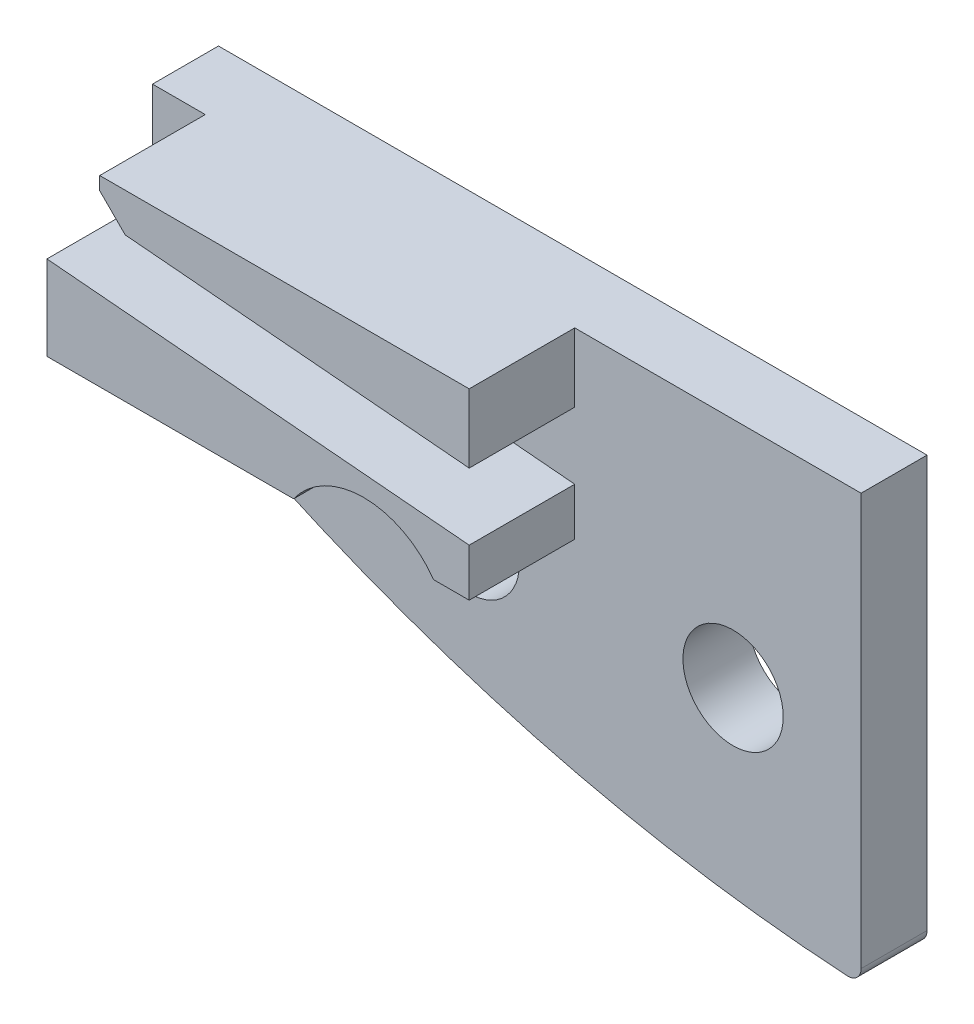
ISO-10303-21;
HEADER;
FILE_DESCRIPTION(('STEP AP214'),'2;1');
FILE_NAME('part.step','',(''),(''),'','','');
FILE_SCHEMA(('AUTOMOTIVE_DESIGN { 1 0 10303 214 1 1 1 1 }'));
ENDSEC;
DATA;
#1=APPLICATION_CONTEXT('core data for automotive mechanical design processes');
#2=APPLICATION_PROTOCOL_DEFINITION('international standard','automotive_design',2000,#1);
#3=PRODUCT_CONTEXT('',#1,'mechanical');
#4=PRODUCT('Part','Part','',(#3));
#5=PRODUCT_RELATED_PRODUCT_CATEGORY('part','',(#4));
#6=PRODUCT_DEFINITION_FORMATION('','',#4);
#7=PRODUCT_DEFINITION_CONTEXT('part definition',#1,'design');
#8=PRODUCT_DEFINITION('design','',#6,#7);
#9=PRODUCT_DEFINITION_SHAPE('','',#8);
#10=(LENGTH_UNIT() NAMED_UNIT(*) SI_UNIT(.MILLI.,.METRE.));
#11=(NAMED_UNIT(*) PLANE_ANGLE_UNIT() SI_UNIT($,.RADIAN.));
#12=(NAMED_UNIT(*) SI_UNIT($,.STERADIAN.) SOLID_ANGLE_UNIT());
#13=UNCERTAINTY_MEASURE_WITH_UNIT(LENGTH_MEASURE(1.E-05),#10,'distance_accuracy_value','');
#14=(GEOMETRIC_REPRESENTATION_CONTEXT(3) GLOBAL_UNCERTAINTY_ASSIGNED_CONTEXT((#13)) GLOBAL_UNIT_ASSIGNED_CONTEXT((#10,
#11,#12)) REPRESENTATION_CONTEXT('',''));
#15=CARTESIAN_POINT('',(0.,0.,0.));
#16=DIRECTION('',(0.,0.,1.));
#17=DIRECTION('',(1.,0.,0.));
#18=AXIS2_PLACEMENT_3D('',#15,#16,#17);
#19=CARTESIAN_POINT('',(-38.1,11.7820282764121,8.255));
#20=DIRECTION('',(0.,1.,0.));
#21=DIRECTION('',(0.,0.,1.));
#22=AXIS2_PLACEMENT_3D('',#19,#20,#21);
#23=PLANE('',#22);
#24=DIRECTION('',(1.,0.,0.));
#25=VECTOR('',#24,1.);
#26=CARTESIAN_POINT('',(-38.1,11.7820282764121,3.175));
#27=LINE('',#26,#25);
#28=CARTESIAN_POINT('',(-38.1,11.7820282764121,3.175));
#29=VERTEX_POINT('',#28);
#30=CARTESIAN_POINT('',(-26.2293716665378,11.7820282764121,3.175));
#31=VERTEX_POINT('',#30);
#32=EDGE_CURVE('E186',#29,#31,#27,.T.);
#33=ORIENTED_EDGE('',*,*,#32,.T.);
#34=DIRECTION('',(0.,0.,1.));
#35=VECTOR('',#34,1.);
#36=CARTESIAN_POINT('',(-26.2293716665378,11.7820282764121,3.175));
#37=LINE('',#36,#35);
#38=CARTESIAN_POINT('',(-26.2293716665378,11.7820282764121,8.255));
#39=VERTEX_POINT('',#38);
#40=EDGE_CURVE('E152',#31,#39,#37,.T.);
#41=ORIENTED_EDGE('',*,*,#40,.T.);
#42=DIRECTION('',(1.,0.,0.));
#43=VECTOR('',#42,1.);
#44=CARTESIAN_POINT('',(-38.1,11.7820282764121,8.255));
#45=LINE('',#44,#43);
#46=CARTESIAN_POINT('',(-38.1,11.7820282764121,8.255));
#47=VERTEX_POINT('',#46);
#48=EDGE_CURVE('E303',#47,#39,#45,.T.);
#49=ORIENTED_EDGE('',*,*,#48,.F.);
#50=DIRECTION('',(0.,0.,-1.));
#51=VECTOR('',#50,1.);
#52=CARTESIAN_POINT('',(-38.1,11.7820282764121,8.255));
#53=LINE('',#52,#51);
#54=EDGE_CURVE('E193',#47,#29,#53,.T.);
#55=ORIENTED_EDGE('',*,*,#54,.T.);
#56=EDGE_LOOP('',(#33,#41,#49,#55));
#57=FACE_BOUND('',#56,.T.);
#58=ADVANCED_FACE('F32',(#57),#23,.F.);
#59=CARTESIAN_POINT('',(0.,76.2,3.175));
#60=DIRECTION('',(0.,0.,-1.));
#61=DIRECTION('',(-1.,0.,0.));
#62=AXIS2_PLACEMENT_3D('',#59,#60,#61);
#63=PLANE('',#62);
#64=CARTESIAN_POINT('',(-10.16,9.398,3.175));
#65=DIRECTION('',(0.,0.,1.));
#66=DIRECTION('',(1.,0.,0.));
#67=AXIS2_PLACEMENT_3D('',#64,#65,#66);
#68=CIRCLE('',#67,2.413);
#69=CARTESIAN_POINT('',(-7.747,9.398,3.175));
#70=VERTEX_POINT('',#69);
#71=EDGE_CURVE('E218',#70,#70,#68,.T.);
#72=ORIENTED_EDGE('',*,*,#71,.F.);
#73=EDGE_LOOP('',(#72));
#74=FACE_BOUND('',#73,.T.);
#75=CARTESIAN_POINT('',(-19.4906283334622,11.7820282764121,3.175));
#76=VERTEX_POINT('',#75);
#77=CARTESIAN_POINT('',(-17.78,11.7820282764121,3.175));
#78=VERTEX_POINT('',#77);
#79=EDGE_CURVE('E161',#76,#78,#27,.T.);
#80=ORIENTED_EDGE('',*,*,#79,.F.);
#81=CARTESIAN_POINT('',(-22.86,9.398,3.175));
#82=DIRECTION('',(0.,0.,1.));
#83=DIRECTION('',(1.,0.,0.));
#84=AXIS2_PLACEMENT_3D('',#81,#82,#83);
#85=CIRCLE('',#84,4.1275);
#86=EDGE_CURVE('E149',#76,#31,#85,.T.);
#87=ORIENTED_EDGE('',*,*,#86,.T.);
#88=ORIENTED_EDGE('',*,*,#32,.F.);
#89=DIRECTION('',(0.,-1.,0.));
#90=VECTOR('',#89,1.);
#91=CARTESIAN_POINT('',(-38.1,20.591373254799,3.175));
#92=LINE('',#91,#90);
#93=CARTESIAN_POINT('',(-38.1,10.5765057315598,3.175));
#94=VERTEX_POINT('',#93);
#95=EDGE_CURVE('E190',#29,#94,#92,.T.);
#96=ORIENTED_EDGE('',*,*,#95,.T.);
#97=CARTESIAN_POINT('',(-37.465,10.5765057315598,3.175));
#98=DIRECTION('',(0.,0.,-1.));
#99=DIRECTION('',(-1.,0.,0.));
#100=AXIS2_PLACEMENT_3D('',#97,#98,#99);
#101=CIRCLE('',#100,0.635);
#102=CARTESIAN_POINT('',(-37.7798319327731,10.0250477965309,3.175));
#103=VERTEX_POINT('',#102);
#104=EDGE_CURVE('E40',#94,#103,#101,.F.);
#105=ORIENTED_EDGE('',*,*,#104,.T.);
#106=CARTESIAN_POINT('',(0.,76.2,3.175));
#107=DIRECTION('',(0.,0.,1.));
#108=DIRECTION('',(-1.,0.,0.));
#109=AXIS2_PLACEMENT_3D('',#106,#107,#108);
#110=CIRCLE('',#109,76.2);
#111=CARTESIAN_POINT('',(-4.67394957983193,0.143480257605869,3.175));
#112=VERTEX_POINT('',#111);
#113=EDGE_CURVE('E224',#103,#112,#110,.T.);
#114=ORIENTED_EDGE('',*,*,#113,.T.);
#115=CARTESIAN_POINT('',(-4.635,0.77728458879249,3.175));
#116=DIRECTION('',(0.,0.,-1.));
#117=DIRECTION('',(-1.,0.,0.));
#118=AXIS2_PLACEMENT_3D('',#115,#116,#117);
#119=CIRCLE('',#118,0.635);
#120=CARTESIAN_POINT('',(-4.,0.77728458879249,3.175));
#121=VERTEX_POINT('',#120);
#122=EDGE_CURVE('E55',#112,#121,#119,.F.);
#123=ORIENTED_EDGE('',*,*,#122,.T.);
#124=DIRECTION('',(0.,-1.,0.));
#125=VECTOR('',#124,1.);
#126=CARTESIAN_POINT('',(-4.,24.7848492803447,3.175));
#127=LINE('',#126,#125);
#128=CARTESIAN_POINT('',(-4.,20.591373254799,3.175));
#129=VERTEX_POINT('',#128);
#130=EDGE_CURVE('E385',#129,#121,#127,.T.);
#131=ORIENTED_EDGE('',*,*,#130,.F.);
#132=DIRECTION('',(-1.,0.,0.));
#133=VECTOR('',#132,1.);
#134=CARTESIAN_POINT('',(0.,20.591373254799,3.175));
#135=LINE('',#134,#133);
#136=CARTESIAN_POINT('',(-17.78,20.591373254799,3.175));
#137=VERTEX_POINT('',#136);
#138=EDGE_CURVE('E228',#129,#137,#135,.T.);
#139=ORIENTED_EDGE('',*,*,#138,.T.);
#140=DIRECTION('',(0.,1.,0.));
#141=VECTOR('',#140,1.);
#142=CARTESIAN_POINT('',(-17.78,20.591373254799,3.175));
#143=LINE('',#142,#141);
#144=CARTESIAN_POINT('',(-17.78,17.2866637367694,3.175));
#145=VERTEX_POINT('',#144);
#146=EDGE_CURVE('E289',#145,#137,#143,.T.);
#147=ORIENTED_EDGE('',*,*,#146,.F.);
#148=DIRECTION('',(0.996227084748133,-0.0867847660262814,0.));
#149=VECTOR('',#148,1.);
#150=CARTESIAN_POINT('',(-17.78,17.2866637367694,3.175));
#151=LINE('',#150,#149);
#152=CARTESIAN_POINT('',(-34.3322104334303,18.7285836882293,3.175));
#153=VERTEX_POINT('',#152);
#154=EDGE_CURVE('E393',#153,#145,#151,.T.);
#155=ORIENTED_EDGE('',*,*,#154,.F.);
#156=DIRECTION('',(0.70710678118655,-0.707106781186546,0.));
#157=VECTOR('',#156,1.);
#158=CARTESIAN_POINT('',(-34.3322104334303,18.7285836882293,3.175));
#159=LINE('',#158,#157);
#160=CARTESIAN_POINT('',(-35.56,19.956373254799,3.175));
#161=VERTEX_POINT('',#160);
#162=EDGE_CURVE('E285',#161,#153,#159,.T.);
#163=ORIENTED_EDGE('',*,*,#162,.F.);
#164=DIRECTION('',(0.,-1.,0.));
#165=VECTOR('',#164,1.);
#166=CARTESIAN_POINT('',(-35.56,19.956373254799,3.175));
#167=LINE('',#166,#165);
#168=CARTESIAN_POINT('',(-35.56,20.591373254799,3.175));
#169=VERTEX_POINT('',#168);
#170=EDGE_CURVE('E283',#169,#161,#167,.T.);
#171=ORIENTED_EDGE('',*,*,#170,.F.);
#172=CARTESIAN_POINT('',(-38.1,20.591373254799,3.175));
#173=VERTEX_POINT('',#172);
#174=EDGE_CURVE('E226',#169,#173,#135,.T.);
#175=ORIENTED_EDGE('',*,*,#174,.T.);
#176=CARTESIAN_POINT('',(-38.1,15.8460282764121,3.175));
#177=VERTEX_POINT('',#176);
#178=EDGE_CURVE('E177',#173,#177,#92,.T.);
#179=ORIENTED_EDGE('',*,*,#178,.T.);
#180=DIRECTION('',(-0.996227084748133,0.0867847660262814,0.));
#181=VECTOR('',#180,1.);
#182=CARTESIAN_POINT('',(-38.1,15.8460282764121,3.175));
#183=LINE('',#182,#181);
#184=CARTESIAN_POINT('',(-17.78,14.0758832234899,3.175));
#185=VERTEX_POINT('',#184);
#186=EDGE_CURVE('E200',#185,#177,#183,.T.);
#187=ORIENTED_EDGE('',*,*,#186,.F.);
#188=DIRECTION('',(0.,1.,0.));
#189=VECTOR('',#188,1.);
#190=CARTESIAN_POINT('',(-17.78,11.7820282764121,3.175));
#191=LINE('',#190,#189);
#192=EDGE_CURVE('E168',#78,#185,#191,.T.);
#193=ORIENTED_EDGE('',*,*,#192,.F.);
#194=EDGE_LOOP('',(#80,#87,#88,#96,#105,#114,#123,#131,#139,#147,#155,#163,#171,#175,#179,#187,#193));
#195=FACE_BOUND('',#194,.T.);
#196=CARTESIAN_POINT('',(-22.86,9.398,3.175));
#197=DIRECTION('',(0.,0.,1.));
#198=DIRECTION('',(1.,0.,0.));
#199=AXIS2_PLACEMENT_3D('',#196,#197,#198);
#200=CIRCLE('',#199,2.413);
#201=CARTESIAN_POINT('',(-20.447,9.398,3.175));
#202=VERTEX_POINT('',#201);
#203=EDGE_CURVE('E212',#202,#202,#200,.T.);
#204=ORIENTED_EDGE('',*,*,#203,.F.);
#205=EDGE_LOOP('',(#204));
#206=FACE_BOUND('',#205,.T.);
#207=ADVANCED_FACE('F165',(#74,#195,#206),#63,.F.);
#208=CARTESIAN_POINT('',(0.,76.2,0.));
#209=DIRECTION('',(0.,0.,-1.));
#210=DIRECTION('',(-1.,0.,0.));
#211=AXIS2_PLACEMENT_3D('',#208,#209,#210);
#212=PLANE('',#211);
#213=CARTESIAN_POINT('',(0.,76.2,0.));
#214=DIRECTION('',(0.,0.,1.));
#215=DIRECTION('',(-1.,0.,0.));
#216=AXIS2_PLACEMENT_3D('',#213,#214,#215);
#217=CIRCLE('',#216,76.2);
#218=CARTESIAN_POINT('',(-37.7798319327731,10.0250477965309,0.));
#219=VERTEX_POINT('',#218);
#220=CARTESIAN_POINT('',(-4.67394957983193,0.143480257605869,0.));
#221=VERTEX_POINT('',#220);
#222=EDGE_CURVE('E221',#219,#221,#217,.T.);
#223=ORIENTED_EDGE('',*,*,#222,.F.);
#224=CARTESIAN_POINT('',(-37.465,10.5765057315598,0.));
#225=DIRECTION('',(0.,0.,-1.));
#226=DIRECTION('',(-1.,0.,0.));
#227=AXIS2_PLACEMENT_3D('',#224,#225,#226);
#228=CIRCLE('',#227,0.635);
#229=CARTESIAN_POINT('',(-38.1,10.5765057315598,0.));
#230=VERTEX_POINT('',#229);
#231=EDGE_CURVE('E258',#219,#230,#228,.T.);
#232=ORIENTED_EDGE('',*,*,#231,.T.);
#233=DIRECTION('',(0.,-1.,0.));
#234=VECTOR('',#233,1.);
#235=CARTESIAN_POINT('',(-38.1,20.591373254799,0.));
#236=LINE('',#235,#234);
#237=CARTESIAN_POINT('',(-38.1,20.591373254799,0.));
#238=VERTEX_POINT('',#237);
#239=EDGE_CURVE('E227',#238,#230,#236,.T.);
#240=ORIENTED_EDGE('',*,*,#239,.F.);
#241=DIRECTION('',(-1.,0.,0.));
#242=VECTOR('',#241,1.);
#243=CARTESIAN_POINT('',(0.,20.591373254799,0.));
#244=LINE('',#243,#242);
#245=CARTESIAN_POINT('',(-4.,20.591373254799,0.));
#246=VERTEX_POINT('',#245);
#247=EDGE_CURVE('E235',#246,#238,#244,.T.);
#248=ORIENTED_EDGE('',*,*,#247,.F.);
#249=DIRECTION('',(0.,1.,0.));
#250=VECTOR('',#249,1.);
#251=CARTESIAN_POINT('',(-4.00000000000001,76.2,0.));
#252=LINE('',#251,#250);
#253=CARTESIAN_POINT('',(-4.,0.77728458879249,0.));
#254=VERTEX_POINT('',#253);
#255=EDGE_CURVE('E387',#254,#246,#252,.T.);
#256=ORIENTED_EDGE('',*,*,#255,.F.);
#257=CARTESIAN_POINT('',(-4.635,0.77728458879249,0.));
#258=DIRECTION('',(0.,0.,-1.));
#259=DIRECTION('',(-1.,0.,0.));
#260=AXIS2_PLACEMENT_3D('',#257,#258,#259);
#261=CIRCLE('',#260,0.635);
#262=EDGE_CURVE('E253',#254,#221,#261,.T.);
#263=ORIENTED_EDGE('',*,*,#262,.T.);
#264=EDGE_LOOP('',(#223,#232,#240,#248,#256,#263));
#265=FACE_BOUND('',#264,.T.);
#266=CARTESIAN_POINT('',(-10.16,9.398,0.));
#267=DIRECTION('',(0.,0.,1.));
#268=DIRECTION('',(1.,0.,0.));
#269=AXIS2_PLACEMENT_3D('',#266,#267,#268);
#270=CIRCLE('',#269,2.413);
#271=CARTESIAN_POINT('',(-7.747,9.398,0.));
#272=VERTEX_POINT('',#271);
#273=EDGE_CURVE('E215',#272,#272,#270,.T.);
#274=ORIENTED_EDGE('',*,*,#273,.T.);
#275=EDGE_LOOP('',(#274));
#276=FACE_BOUND('',#275,.T.);
#277=CARTESIAN_POINT('',(-22.86,9.398,0.));
#278=DIRECTION('',(0.,0.,1.));
#279=DIRECTION('',(1.,0.,0.));
#280=AXIS2_PLACEMENT_3D('',#277,#278,#279);
#281=CIRCLE('',#280,2.413);
#282=CARTESIAN_POINT('',(-20.447,9.398,0.));
#283=VERTEX_POINT('',#282);
#284=EDGE_CURVE('E196',#283,#283,#281,.T.);
#285=ORIENTED_EDGE('',*,*,#284,.T.);
#286=EDGE_LOOP('',(#285));
#287=FACE_BOUND('',#286,.T.);
#288=ADVANCED_FACE('F269',(#265,#276,#287),#212,.T.);
#289=CARTESIAN_POINT('',(0.,76.2,3.175));
#290=DIRECTION('',(0.,0.,-1.));
#291=DIRECTION('',(-1.,0.,0.));
#292=AXIS2_PLACEMENT_3D('',#289,#290,#291);
#293=CYLINDRICAL_SURFACE('',#292,76.2);
#294=ORIENTED_EDGE('',*,*,#113,.F.);
#295=DIRECTION('',(0.,0.,-1.));
#296=VECTOR('',#295,1.);
#297=CARTESIAN_POINT('',(-37.7798319327731,10.0250477965309,3.175));
#298=LINE('',#297,#296);
#299=EDGE_CURVE('E248',#103,#219,#298,.T.);
#300=ORIENTED_EDGE('',*,*,#299,.T.);
#301=ORIENTED_EDGE('',*,*,#222,.T.);
#302=DIRECTION('',(0.,0.,-1.));
#303=VECTOR('',#302,1.);
#304=CARTESIAN_POINT('',(-4.67394957983193,0.143480257605882,3.175));
#305=LINE('',#304,#303);
#306=EDGE_CURVE('E174',#221,#112,#305,.F.);
#307=ORIENTED_EDGE('',*,*,#306,.T.);
#308=EDGE_LOOP('',(#294,#300,#301,#307));
#309=FACE_BOUND('',#308,.T.);
#310=ADVANCED_FACE('F246',(#309),#293,.T.);
#311=CARTESIAN_POINT('',(0.,20.591373254799,3.175));
#312=DIRECTION('',(0.,-1.,0.));
#313=DIRECTION('',(1.,0.,0.));
#314=AXIS2_PLACEMENT_3D('',#311,#312,#313);
#315=PLANE('',#314);
#316=ORIENTED_EDGE('',*,*,#138,.F.);
#317=DIRECTION('',(0.,0.,-1.));
#318=VECTOR('',#317,1.);
#319=CARTESIAN_POINT('',(-4.,20.591373254799,3.175));
#320=LINE('',#319,#318);
#321=EDGE_CURVE('E170',#129,#246,#320,.T.);
#322=ORIENTED_EDGE('',*,*,#321,.T.);
#323=ORIENTED_EDGE('',*,*,#247,.T.);
#324=DIRECTION('',(0.,0.,-1.));
#325=VECTOR('',#324,1.);
#326=CARTESIAN_POINT('',(-38.1,20.591373254799,3.175));
#327=LINE('',#326,#325);
#328=EDGE_CURVE('E171',#173,#238,#327,.T.);
#329=ORIENTED_EDGE('',*,*,#328,.F.);
#330=ORIENTED_EDGE('',*,*,#174,.F.);
#331=DIRECTION('',(0.,0.,-1.));
#332=VECTOR('',#331,1.);
#333=CARTESIAN_POINT('',(-35.56,20.591373254799,8.255));
#334=LINE('',#333,#332);
#335=CARTESIAN_POINT('',(-35.56,20.591373254799,8.255));
#336=VERTEX_POINT('',#335);
#337=EDGE_CURVE('E280',#336,#169,#334,.T.);
#338=ORIENTED_EDGE('',*,*,#337,.F.);
#339=DIRECTION('',(-1.,0.,0.));
#340=VECTOR('',#339,1.);
#341=CARTESIAN_POINT('',(-35.56,20.591373254799,8.255));
#342=LINE('',#341,#340);
#343=CARTESIAN_POINT('',(-17.78,20.591373254799,8.255));
#344=VERTEX_POINT('',#343);
#345=EDGE_CURVE('E392',#344,#336,#342,.T.);
#346=ORIENTED_EDGE('',*,*,#345,.F.);
#347=DIRECTION('',(0.,0.,-1.));
#348=VECTOR('',#347,1.);
#349=CARTESIAN_POINT('',(-17.78,20.591373254799,8.255));
#350=LINE('',#349,#348);
#351=EDGE_CURVE('E189',#344,#137,#350,.T.);
#352=ORIENTED_EDGE('',*,*,#351,.T.);
#353=EDGE_LOOP('',(#316,#322,#323,#329,#330,#338,#346,#352));
#354=FACE_BOUND('',#353,.T.);
#355=ADVANCED_FACE('F276',(#354),#315,.F.);
#356=CARTESIAN_POINT('',(-38.1,20.591373254799,3.175));
#357=DIRECTION('',(1.,0.,0.));
#358=DIRECTION('',(0.,0.,-1.));
#359=AXIS2_PLACEMENT_3D('',#356,#357,#358);
#360=PLANE('',#359);
#361=ORIENTED_EDGE('',*,*,#239,.T.);
#362=DIRECTION('',(0.,0.,-1.));
#363=VECTOR('',#362,1.);
#364=CARTESIAN_POINT('',(-38.1,10.5765057315598,3.175));
#365=LINE('',#364,#363);
#366=EDGE_CURVE('E260',#230,#94,#365,.F.);
#367=ORIENTED_EDGE('',*,*,#366,.T.);
#368=ORIENTED_EDGE('',*,*,#95,.F.);
#369=ORIENTED_EDGE('',*,*,#54,.F.);
#370=DIRECTION('',(0.,-1.,0.));
#371=VECTOR('',#370,1.);
#372=CARTESIAN_POINT('',(-38.1,15.8460282764121,8.255));
#373=LINE('',#372,#371);
#374=CARTESIAN_POINT('',(-38.1,15.8460282764121,8.255));
#375=VERTEX_POINT('',#374);
#376=EDGE_CURVE('E203',#375,#47,#373,.T.);
#377=ORIENTED_EDGE('',*,*,#376,.F.);
#378=DIRECTION('',(0.,0.,-1.));
#379=VECTOR('',#378,1.);
#380=CARTESIAN_POINT('',(-38.1,15.8460282764121,8.255));
#381=LINE('',#380,#379);
#382=EDGE_CURVE('E204',#375,#177,#381,.T.);
#383=ORIENTED_EDGE('',*,*,#382,.T.);
#384=ORIENTED_EDGE('',*,*,#178,.F.);
#385=ORIENTED_EDGE('',*,*,#328,.T.);
#386=EDGE_LOOP('',(#361,#367,#368,#369,#377,#383,#384,#385));
#387=FACE_BOUND('',#386,.T.);
#388=ADVANCED_FACE('F272',(#387),#360,.F.);
#389=CARTESIAN_POINT('',(-10.16,9.398,3.175));
#390=DIRECTION('',(0.,0.,-1.));
#391=DIRECTION('',(-1.,0.,0.));
#392=AXIS2_PLACEMENT_3D('',#389,#390,#391);
#393=CYLINDRICAL_SURFACE('',#392,2.413);
#394=ORIENTED_EDGE('',*,*,#71,.T.);
#395=EDGE_LOOP('',(#394));
#396=FACE_BOUND('',#395,.T.);
#397=ORIENTED_EDGE('',*,*,#273,.F.);
#398=EDGE_LOOP('',(#397));
#399=FACE_BOUND('',#398,.T.);
#400=ADVANCED_FACE('F337',(#396,#399),#393,.F.);
#401=CARTESIAN_POINT('',(-22.86,9.398,3.175));
#402=DIRECTION('',(0.,0.,-1.));
#403=DIRECTION('',(-1.,0.,0.));
#404=AXIS2_PLACEMENT_3D('',#401,#402,#403);
#405=CYLINDRICAL_SURFACE('',#404,2.413);
#406=ORIENTED_EDGE('',*,*,#203,.T.);
#407=EDGE_LOOP('',(#406));
#408=FACE_BOUND('',#407,.T.);
#409=ORIENTED_EDGE('',*,*,#284,.F.);
#410=EDGE_LOOP('',(#409));
#411=FACE_BOUND('',#410,.T.);
#412=ADVANCED_FACE('F325',(#408,#411),#405,.F.);
#413=CARTESIAN_POINT('',(-19.4906283334622,11.7820282764121,8.255));
#414=VERTEX_POINT('',#413);
#415=CARTESIAN_POINT('',(-17.78,11.7820282764121,8.255));
#416=VERTEX_POINT('',#415);
#417=EDGE_CURVE('E163',#414,#416,#45,.T.);
#418=ORIENTED_EDGE('',*,*,#417,.F.);
#419=DIRECTION('',(0.,0.,1.));
#420=VECTOR('',#419,1.);
#421=CARTESIAN_POINT('',(-19.4906283334622,11.7820282764121,3.175));
#422=LINE('',#421,#420);
#423=EDGE_CURVE('E47',#414,#76,#422,.F.);
#424=ORIENTED_EDGE('',*,*,#423,.T.);
#425=ORIENTED_EDGE('',*,*,#79,.T.);
#426=DIRECTION('',(0.,0.,-1.));
#427=VECTOR('',#426,1.);
#428=CARTESIAN_POINT('',(-17.78,11.7820282764121,8.255));
#429=LINE('',#428,#427);
#430=EDGE_CURVE('E197',#416,#78,#429,.T.);
#431=ORIENTED_EDGE('',*,*,#430,.F.);
#432=EDGE_LOOP('',(#418,#424,#425,#431));
#433=FACE_BOUND('',#432,.T.);
#434=ADVANCED_FACE('F159',(#433),#23,.F.);
#435=CARTESIAN_POINT('',(-17.78,11.7820282764121,8.255));
#436=DIRECTION('',(-1.,0.,0.));
#437=DIRECTION('',(0.,0.,1.));
#438=AXIS2_PLACEMENT_3D('',#435,#436,#437);
#439=PLANE('',#438);
#440=ORIENTED_EDGE('',*,*,#192,.T.);
#441=DIRECTION('',(0.,0.,-1.));
#442=VECTOR('',#441,1.);
#443=CARTESIAN_POINT('',(-17.78,14.0758832234899,8.255));
#444=LINE('',#443,#442);
#445=CARTESIAN_POINT('',(-17.78,14.0758832234899,8.255));
#446=VERTEX_POINT('',#445);
#447=EDGE_CURVE('E208',#446,#185,#444,.T.);
#448=ORIENTED_EDGE('',*,*,#447,.F.);
#449=DIRECTION('',(0.,1.,0.));
#450=VECTOR('',#449,1.);
#451=CARTESIAN_POINT('',(-17.78,11.7820282764121,8.255));
#452=LINE('',#451,#450);
#453=EDGE_CURVE('E305',#416,#446,#452,.T.);
#454=ORIENTED_EDGE('',*,*,#453,.F.);
#455=ORIENTED_EDGE('',*,*,#430,.T.);
#456=EDGE_LOOP('',(#440,#448,#454,#455));
#457=FACE_BOUND('',#456,.T.);
#458=ADVANCED_FACE('F316',(#457),#439,.F.);
#459=CARTESIAN_POINT('',(-38.1,15.8460282764121,8.255));
#460=DIRECTION('',(-0.0867847660262814,-0.996227084748133,0.));
#461=DIRECTION('',(0.996227084748133,-0.0867847660262814,0.));
#462=AXIS2_PLACEMENT_3D('',#459,#460,#461);
#463=PLANE('',#462);
#464=ORIENTED_EDGE('',*,*,#186,.T.);
#465=ORIENTED_EDGE('',*,*,#382,.F.);
#466=DIRECTION('',(-0.996227084748133,0.0867847660262814,0.));
#467=VECTOR('',#466,1.);
#468=CARTESIAN_POINT('',(-38.1,15.8460282764121,8.255));
#469=LINE('',#468,#467);
#470=EDGE_CURVE('E182',#446,#375,#469,.T.);
#471=ORIENTED_EDGE('',*,*,#470,.F.);
#472=ORIENTED_EDGE('',*,*,#447,.T.);
#473=EDGE_LOOP('',(#464,#465,#471,#472));
#474=FACE_BOUND('',#473,.T.);
#475=ADVANCED_FACE('F314',(#474),#463,.F.);
#476=CARTESIAN_POINT('',(0.,0.,8.255));
#477=DIRECTION('',(0.,0.,1.));
#478=DIRECTION('',(1.,0.,0.));
#479=AXIS2_PLACEMENT_3D('',#476,#477,#478);
#480=PLANE('',#479);
#481=CARTESIAN_POINT('',(-22.86,9.398,8.255));
#482=DIRECTION('',(0.,0.,1.));
#483=DIRECTION('',(1.,0.,0.));
#484=AXIS2_PLACEMENT_3D('',#481,#482,#483);
#485=CIRCLE('',#484,4.1275);
#486=EDGE_CURVE('E155',#414,#39,#485,.T.);
#487=ORIENTED_EDGE('',*,*,#486,.F.);
#488=ORIENTED_EDGE('',*,*,#417,.T.);
#489=ORIENTED_EDGE('',*,*,#453,.T.);
#490=ORIENTED_EDGE('',*,*,#470,.T.);
#491=ORIENTED_EDGE('',*,*,#376,.T.);
#492=ORIENTED_EDGE('',*,*,#48,.T.);
#493=EDGE_LOOP('',(#487,#488,#489,#490,#491,#492));
#494=FACE_BOUND('',#493,.T.);
#495=ADVANCED_FACE('F323',(#494),#480,.T.);
#496=CARTESIAN_POINT('',(-17.78,20.591373254799,8.255));
#497=DIRECTION('',(-1.,0.,0.));
#498=DIRECTION('',(0.,0.,1.));
#499=AXIS2_PLACEMENT_3D('',#496,#497,#498);
#500=PLANE('',#499);
#501=ORIENTED_EDGE('',*,*,#146,.T.);
#502=ORIENTED_EDGE('',*,*,#351,.F.);
#503=DIRECTION('',(0.,1.,0.));
#504=VECTOR('',#503,1.);
#505=CARTESIAN_POINT('',(-17.78,20.591373254799,8.255));
#506=LINE('',#505,#504);
#507=CARTESIAN_POINT('',(-17.78,17.2866637367694,8.255));
#508=VERTEX_POINT('',#507);
#509=EDGE_CURVE('E389',#508,#344,#506,.T.);
#510=ORIENTED_EDGE('',*,*,#509,.F.);
#511=DIRECTION('',(0.,0.,-1.));
#512=VECTOR('',#511,1.);
#513=CARTESIAN_POINT('',(-17.78,17.2866637367694,8.255));
#514=LINE('',#513,#512);
#515=EDGE_CURVE('E400',#508,#145,#514,.T.);
#516=ORIENTED_EDGE('',*,*,#515,.T.);
#517=EDGE_LOOP('',(#501,#502,#510,#516));
#518=FACE_BOUND('',#517,.T.);
#519=ADVANCED_FACE('F375',(#518),#500,.F.);
#520=CARTESIAN_POINT('',(-35.56,19.956373254799,8.255));
#521=DIRECTION('',(1.,0.,0.));
#522=DIRECTION('',(0.,0.,-1.));
#523=AXIS2_PLACEMENT_3D('',#520,#521,#522);
#524=PLANE('',#523);
#525=ORIENTED_EDGE('',*,*,#170,.T.);
#526=DIRECTION('',(0.,0.,-1.));
#527=VECTOR('',#526,1.);
#528=CARTESIAN_POINT('',(-35.56,19.956373254799,8.255));
#529=LINE('',#528,#527);
#530=CARTESIAN_POINT('',(-35.56,19.956373254799,8.255));
#531=VERTEX_POINT('',#530);
#532=EDGE_CURVE('E293',#531,#161,#529,.T.);
#533=ORIENTED_EDGE('',*,*,#532,.F.);
#534=DIRECTION('',(0.,-1.,0.));
#535=VECTOR('',#534,1.);
#536=CARTESIAN_POINT('',(-35.56,19.956373254799,8.255));
#537=LINE('',#536,#535);
#538=EDGE_CURVE('E292',#336,#531,#537,.T.);
#539=ORIENTED_EDGE('',*,*,#538,.F.);
#540=ORIENTED_EDGE('',*,*,#337,.T.);
#541=EDGE_LOOP('',(#525,#533,#539,#540));
#542=FACE_BOUND('',#541,.T.);
#543=ADVANCED_FACE('F291',(#542),#524,.F.);
#544=CARTESIAN_POINT('',(-34.3322104334303,18.7285836882293,8.255));
#545=DIRECTION('',(0.707106781186545,0.70710678118655,0.));
#546=DIRECTION('',(-0.70710678118655,0.707106781186545,0.));
#547=AXIS2_PLACEMENT_3D('',#544,#545,#546);
#548=PLANE('',#547);
#549=ORIENTED_EDGE('',*,*,#162,.T.);
#550=DIRECTION('',(0.,0.,-1.));
#551=VECTOR('',#550,1.);
#552=CARTESIAN_POINT('',(-34.3322104334303,18.7285836882293,8.255));
#553=LINE('',#552,#551);
#554=CARTESIAN_POINT('',(-34.3322104334303,18.7285836882293,8.255));
#555=VERTEX_POINT('',#554);
#556=EDGE_CURVE('E297',#555,#153,#553,.T.);
#557=ORIENTED_EDGE('',*,*,#556,.F.);
#558=DIRECTION('',(0.70710678118655,-0.707106781186546,0.));
#559=VECTOR('',#558,1.);
#560=CARTESIAN_POINT('',(-34.3322104334303,18.7285836882293,8.255));
#561=LINE('',#560,#559);
#562=EDGE_CURVE('E396',#531,#555,#561,.T.);
#563=ORIENTED_EDGE('',*,*,#562,.F.);
#564=ORIENTED_EDGE('',*,*,#532,.T.);
#565=EDGE_LOOP('',(#549,#557,#563,#564));
#566=FACE_BOUND('',#565,.T.);
#567=ADVANCED_FACE('F368',(#566),#548,.F.);
#568=CARTESIAN_POINT('',(-17.78,17.2866637367694,8.255));
#569=DIRECTION('',(0.0867847660262814,0.996227084748133,0.));
#570=DIRECTION('',(-0.996227084748133,0.0867847660262814,0.));
#571=AXIS2_PLACEMENT_3D('',#568,#569,#570);
#572=PLANE('',#571);
#573=ORIENTED_EDGE('',*,*,#154,.T.);
#574=ORIENTED_EDGE('',*,*,#515,.F.);
#575=DIRECTION('',(0.996227084748133,-0.0867847660262814,0.));
#576=VECTOR('',#575,1.);
#577=CARTESIAN_POINT('',(-17.78,17.2866637367694,8.255));
#578=LINE('',#577,#576);
#579=EDGE_CURVE('E398',#555,#508,#578,.T.);
#580=ORIENTED_EDGE('',*,*,#579,.F.);
#581=ORIENTED_EDGE('',*,*,#556,.T.);
#582=EDGE_LOOP('',(#573,#574,#580,#581));
#583=FACE_BOUND('',#582,.T.);
#584=ADVANCED_FACE('F361',(#583),#572,.F.);
#585=CARTESIAN_POINT('',(0.,0.,8.255));
#586=DIRECTION('',(0.,0.,1.));
#587=DIRECTION('',(1.,0.,0.));
#588=AXIS2_PLACEMENT_3D('',#585,#586,#587);
#589=PLANE('',#588);
#590=ORIENTED_EDGE('',*,*,#509,.T.);
#591=ORIENTED_EDGE('',*,*,#345,.T.);
#592=ORIENTED_EDGE('',*,*,#538,.T.);
#593=ORIENTED_EDGE('',*,*,#562,.T.);
#594=ORIENTED_EDGE('',*,*,#579,.T.);
#595=EDGE_LOOP('',(#590,#591,#592,#593,#594));
#596=FACE_BOUND('',#595,.T.);
#597=ADVANCED_FACE('F355',(#596),#589,.T.);
#598=CARTESIAN_POINT('',(-4.,24.7848492803447,-1.905));
#599=DIRECTION('',(-1.,0.,0.));
#600=DIRECTION('',(0.,-1.,0.));
#601=AXIS2_PLACEMENT_3D('',#598,#599,#600);
#602=PLANE('',#601);
#603=ORIENTED_EDGE('',*,*,#130,.T.);
#604=DIRECTION('',(0.,0.,-1.));
#605=VECTOR('',#604,1.);
#606=CARTESIAN_POINT('',(-4.,0.77728458879249,-1.905));
#607=LINE('',#606,#605);
#608=EDGE_CURVE('E11',#121,#254,#607,.T.);
#609=ORIENTED_EDGE('',*,*,#608,.T.);
#610=ORIENTED_EDGE('',*,*,#255,.T.);
#611=ORIENTED_EDGE('',*,*,#321,.F.);
#612=EDGE_LOOP('',(#603,#609,#610,#611));
#613=FACE_BOUND('',#612,.T.);
#614=ADVANCED_FACE('F350',(#613),#602,.F.);
#615=CARTESIAN_POINT('',(-37.465,10.5765057315598,3.175));
#616=DIRECTION('',(0.,0.,-1.));
#617=DIRECTION('',(-1.,0.,0.));
#618=AXIS2_PLACEMENT_3D('',#615,#616,#617);
#619=CYLINDRICAL_SURFACE('',#618,0.635);
#620=ORIENTED_EDGE('',*,*,#104,.F.);
#621=ORIENTED_EDGE('',*,*,#366,.F.);
#622=ORIENTED_EDGE('',*,*,#231,.F.);
#623=ORIENTED_EDGE('',*,*,#299,.F.);
#624=EDGE_LOOP('',(#620,#621,#622,#623));
#625=FACE_BOUND('',#624,.T.);
#626=ADVANCED_FACE('F267',(#625),#619,.T.);
#627=CARTESIAN_POINT('',(-4.635,0.77728458879249,3.175));
#628=DIRECTION('',(0.,0.,-1.));
#629=DIRECTION('',(-1.,0.,0.));
#630=AXIS2_PLACEMENT_3D('',#627,#628,#629);
#631=CYLINDRICAL_SURFACE('',#630,0.635);
#632=ORIENTED_EDGE('',*,*,#262,.F.);
#633=ORIENTED_EDGE('',*,*,#608,.F.);
#634=ORIENTED_EDGE('',*,*,#122,.F.);
#635=ORIENTED_EDGE('',*,*,#306,.F.);
#636=EDGE_LOOP('',(#632,#633,#634,#635));
#637=FACE_BOUND('',#636,.T.);
#638=ADVANCED_FACE('F34',(#637),#631,.T.);
#639=CARTESIAN_POINT('',(-22.86,9.398,3.175));
#640=DIRECTION('',(0.,0.,1.));
#641=DIRECTION('',(1.,0.,0.));
#642=AXIS2_PLACEMENT_3D('',#639,#640,#641);
#643=CYLINDRICAL_SURFACE('',#642,4.1275);
#644=ORIENTED_EDGE('',*,*,#86,.F.);
#645=ORIENTED_EDGE('',*,*,#423,.F.);
#646=ORIENTED_EDGE('',*,*,#486,.T.);
#647=ORIENTED_EDGE('',*,*,#40,.F.);
#648=EDGE_LOOP('',(#644,#645,#646,#647));
#649=FACE_BOUND('',#648,.T.);
#650=ADVANCED_FACE('F150',(#649),#643,.F.);
#651=CLOSED_SHELL('',(#58,#207,#288,#310,#355,#388,#400,#412,#434,#458,#475,#495,#519,#543,#567,
#584,#597,#614,#626,#638,#650));
#652=MANIFOLD_SOLID_BREP('B2',#651);
#653=ADVANCED_BREP_SHAPE_REPRESENTATION('',(#18,#652),#14);
#654=SHAPE_DEFINITION_REPRESENTATION(#9,#653);
ENDSEC;
END-ISO-10303-21;
